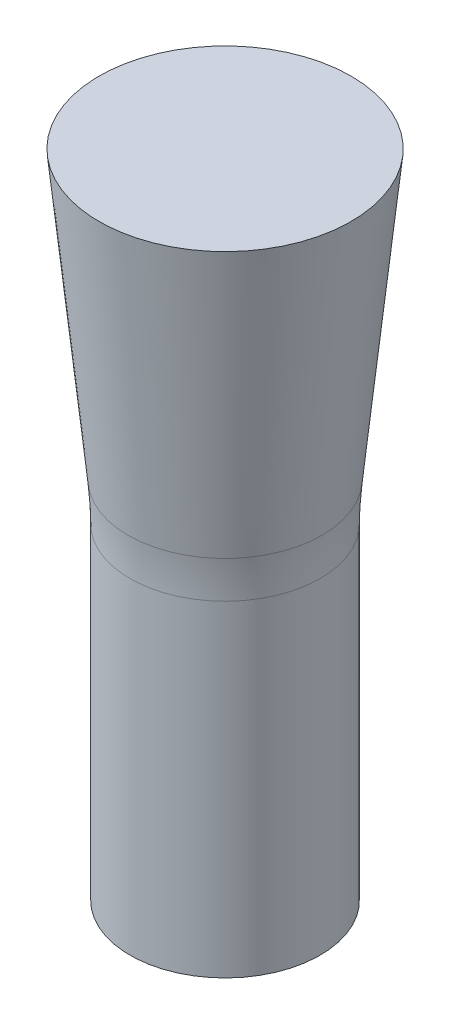
ISO-10303-21;
HEADER;
FILE_DESCRIPTION(('STEP AP214'),'2;1');
FILE_NAME('part.step','',(''),(''),'','','');
FILE_SCHEMA(('AUTOMOTIVE_DESIGN { 1 0 10303 214 1 1 1 1 }'));
ENDSEC;
DATA;
#1=APPLICATION_CONTEXT('core data for automotive mechanical design processes');
#2=APPLICATION_PROTOCOL_DEFINITION('international standard','automotive_design',2000,#1);
#3=PRODUCT_CONTEXT('',#1,'mechanical');
#4=PRODUCT('Part','Part','',(#3));
#5=PRODUCT_RELATED_PRODUCT_CATEGORY('part','',(#4));
#6=PRODUCT_DEFINITION_FORMATION('','',#4);
#7=PRODUCT_DEFINITION_CONTEXT('part definition',#1,'design');
#8=PRODUCT_DEFINITION('design','',#6,#7);
#9=PRODUCT_DEFINITION_SHAPE('','',#8);
#10=(LENGTH_UNIT() NAMED_UNIT(*) SI_UNIT(.MILLI.,.METRE.));
#11=(NAMED_UNIT(*) PLANE_ANGLE_UNIT() SI_UNIT($,.RADIAN.));
#12=(NAMED_UNIT(*) SI_UNIT($,.STERADIAN.) SOLID_ANGLE_UNIT());
#13=UNCERTAINTY_MEASURE_WITH_UNIT(LENGTH_MEASURE(1.E-05),#10,'distance_accuracy_value','');
#14=(GEOMETRIC_REPRESENTATION_CONTEXT(3) GLOBAL_UNCERTAINTY_ASSIGNED_CONTEXT((#13)) GLOBAL_UNIT_ASSIGNED_CONTEXT((#10,
#11,#12)) REPRESENTATION_CONTEXT('',''));
#15=CARTESIAN_POINT('',(0.,0.,0.));
#16=DIRECTION('',(0.,0.,1.));
#17=DIRECTION('',(1.,0.,0.));
#18=AXIS2_PLACEMENT_3D('',#15,#16,#17);
#19=CARTESIAN_POINT('',(2.49,0.,0.));
#20=DIRECTION('',(0.,-1.,0.));
#21=DIRECTION('',(0.,0.,-1.));
#22=AXIS2_PLACEMENT_3D('',#19,#20,#21);
#23=PLANE('',#22);
#24=CARTESIAN_POINT('',(0.,0.,0.));
#25=DIRECTION('',(0.,-1.,0.));
#26=DIRECTION('',(0.,0.,-1.));
#27=AXIS2_PLACEMENT_3D('',#24,#25,#26);
#28=CIRCLE('',#27,2.49);
#29=CARTESIAN_POINT('',(0.,0.,-2.49));
#30=VERTEX_POINT('',#29);
#31=EDGE_CURVE('E48',#30,#30,#28,.T.);
#32=ORIENTED_EDGE('',*,*,#31,.T.);
#33=EDGE_LOOP('',(#32));
#34=FACE_BOUND('',#33,.T.);
#35=ADVANCED_FACE('F34',(#34),#23,.T.);
#36=CARTESIAN_POINT('',(3.3,17.05,0.));
#37=DIRECTION('',(0.,1.,0.));
#38=DIRECTION('',(0.,0.,1.));
#39=AXIS2_PLACEMENT_3D('',#36,#37,#38);
#40=PLANE('',#39);
#41=CARTESIAN_POINT('',(0.,17.05,0.));
#42=DIRECTION('',(0.,-1.,0.));
#43=DIRECTION('',(0.,0.,-1.));
#44=AXIS2_PLACEMENT_3D('',#41,#42,#43);
#45=CIRCLE('',#44,3.3);
#46=CARTESIAN_POINT('',(0.,17.05,-3.3));
#47=VERTEX_POINT('',#46);
#48=EDGE_CURVE('E10',#47,#47,#45,.T.);
#49=ORIENTED_EDGE('',*,*,#48,.F.);
#50=EDGE_LOOP('',(#49));
#51=FACE_BOUND('',#50,.T.);
#52=ADVANCED_FACE('F66',(#51),#40,.T.);
#53=CARTESIAN_POINT('',(0.,9.55239056687762,0.));
#54=DIRECTION('',(0.,1.,0.));
#55=DIRECTION('',(0.,0.,1.));
#56=AXIS2_PLACEMENT_3D('',#53,#54,#55);
#57=CONICAL_SURFACE('',#56,2.54086704489636,0.100906122469576);
#58=ORIENTED_EDGE('',*,*,#48,.T.);
#59=EDGE_LOOP('',(#58));
#60=FACE_BOUND('',#59,.T.);
#61=CARTESIAN_POINT('',(0.,9.55239056687762,0.));
#62=DIRECTION('',(0.,-1.,0.));
#63=DIRECTION('',(0.,0.,-1.));
#64=AXIS2_PLACEMENT_3D('',#61,#62,#63);
#65=CIRCLE('',#64,2.54086704489636);
#66=CARTESIAN_POINT('',(0.,9.55239056687762,-2.54086704489636));
#67=VERTEX_POINT('',#66);
#68=EDGE_CURVE('E40',#67,#67,#65,.T.);
#69=ORIENTED_EDGE('',*,*,#68,.F.);
#70=EDGE_LOOP('',(#69));
#71=FACE_BOUND('',#70,.T.);
#72=ADVANCED_FACE('F63',(#60,#71),#57,.T.);
#73=CARTESIAN_POINT('',(0.,8.54504085517337,0.));
#74=DIRECTION('',(0.,-1.,0.));
#75=DIRECTION('',(0.,0.,-1.));
#76=AXIS2_PLACEMENT_3D('',#73,#74,#75);
#77=TOROIDAL_SURFACE('',#76,12.49,10.);
#78=ORIENTED_EDGE('',*,*,#68,.T.);
#79=EDGE_LOOP('',(#78));
#80=FACE_BOUND('',#79,.T.);
#81=CARTESIAN_POINT('',(0.,8.5450408551733,0.));
#82=DIRECTION('',(0.,-1.,0.));
#83=DIRECTION('',(0.,0.,-1.));
#84=AXIS2_PLACEMENT_3D('',#81,#82,#83);
#85=CIRCLE('',#84,2.49);
#86=CARTESIAN_POINT('',(0.,8.5450408551733,-2.49));
#87=VERTEX_POINT('',#86);
#88=EDGE_CURVE('E44',#87,#87,#85,.T.);
#89=ORIENTED_EDGE('',*,*,#88,.F.);
#90=EDGE_LOOP('',(#89));
#91=FACE_BOUND('',#90,.T.);
#92=ADVANCED_FACE('F57',(#80,#91),#77,.F.);
#93=CARTESIAN_POINT('',(0.,0.,0.));
#94=DIRECTION('',(0.,-1.,0.));
#95=DIRECTION('',(0.,0.,-1.));
#96=AXIS2_PLACEMENT_3D('',#93,#94,#95);
#97=CYLINDRICAL_SURFACE('',#96,2.49);
#98=ORIENTED_EDGE('',*,*,#88,.T.);
#99=EDGE_LOOP('',(#98));
#100=FACE_BOUND('',#99,.T.);
#101=ORIENTED_EDGE('',*,*,#31,.F.);
#102=EDGE_LOOP('',(#101));
#103=FACE_BOUND('',#102,.T.);
#104=ADVANCED_FACE('F55',(#100,#103),#97,.T.);
#105=CLOSED_SHELL('',(#35,#52,#72,#92,#104));
#106=MANIFOLD_SOLID_BREP('B2',#105);
#107=ADVANCED_BREP_SHAPE_REPRESENTATION('',(#18,#106),#14);
#108=SHAPE_DEFINITION_REPRESENTATION(#9,#107);
ENDSEC;
END-ISO-10303-21;
